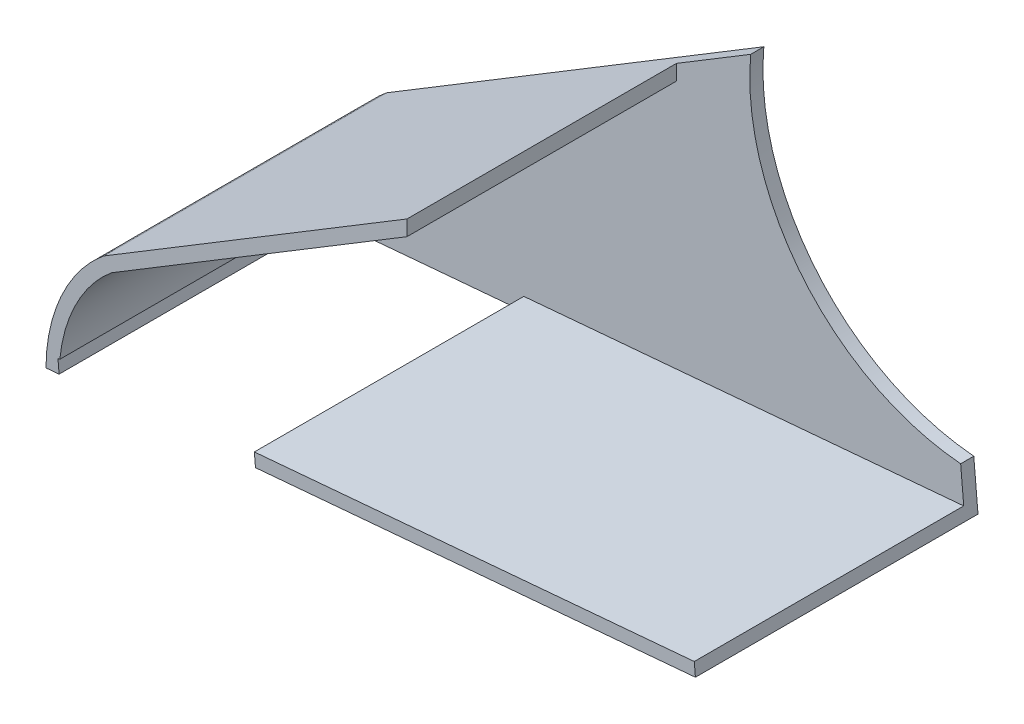
ISO-10303-21;
HEADER;
FILE_DESCRIPTION(('STEP AP214'),'2;1');
FILE_NAME('part.step','',(''),(''),'','','');
FILE_SCHEMA(('AUTOMOTIVE_DESIGN { 1 0 10303 214 1 1 1 1 }'));
ENDSEC;
DATA;
#1=APPLICATION_CONTEXT('core data for automotive mechanical design processes');
#2=APPLICATION_PROTOCOL_DEFINITION('international standard','automotive_design',2000,#1);
#3=PRODUCT_CONTEXT('',#1,'mechanical');
#4=PRODUCT('Part','Part','',(#3));
#5=PRODUCT_RELATED_PRODUCT_CATEGORY('part','',(#4));
#6=PRODUCT_DEFINITION_FORMATION('','',#4);
#7=PRODUCT_DEFINITION_CONTEXT('part definition',#1,'design');
#8=PRODUCT_DEFINITION('design','',#6,#7);
#9=PRODUCT_DEFINITION_SHAPE('','',#8);
#10=(LENGTH_UNIT() NAMED_UNIT(*) SI_UNIT(.MILLI.,.METRE.));
#11=(NAMED_UNIT(*) PLANE_ANGLE_UNIT() SI_UNIT($,.RADIAN.));
#12=(NAMED_UNIT(*) SI_UNIT($,.STERADIAN.) SOLID_ANGLE_UNIT());
#13=UNCERTAINTY_MEASURE_WITH_UNIT(LENGTH_MEASURE(1.E-05),#10,'distance_accuracy_value','');
#14=(GEOMETRIC_REPRESENTATION_CONTEXT(3) GLOBAL_UNCERTAINTY_ASSIGNED_CONTEXT((#13)) GLOBAL_UNIT_ASSIGNED_CONTEXT((#10,
#11,#12)) REPRESENTATION_CONTEXT('',''));
#15=CARTESIAN_POINT('',(0.,0.,0.));
#16=DIRECTION('',(0.,0.,1.));
#17=DIRECTION('',(1.,0.,0.));
#18=AXIS2_PLACEMENT_3D('',#15,#16,#17);
#19=CARTESIAN_POINT('',(0.,0.,40.5));
#20=DIRECTION('',(0.,0.,-1.));
#21=DIRECTION('',(-1.,0.,0.));
#22=AXIS2_PLACEMENT_3D('',#19,#20,#21);
#23=PLANE('',#22);
#24=DIRECTION('',(0.996194698091746,0.0871557427476548,0.));
#25=VECTOR('',#24,1.);
#26=CARTESIAN_POINT('',(3.64727503883378,-41.6885444564277,40.5));
#27=LINE('',#26,#25);
#28=CARTESIAN_POINT('',(-69.2564137144437,-48.0667907515616,40.5));
#29=VERTEX_POINT('',#28);
#30=CARTESIAN_POINT('',(-2.31617525973404,-42.2102787530527,40.5));
#31=VERTEX_POINT('',#30);
#32=EDGE_CURVE('E38',#29,#31,#27,.T.);
#33=ORIENTED_EDGE('',*,*,#32,.T.);
#34=DIRECTION('',(0.0871557427476548,-0.996194698091746,0.));
#35=VECTOR('',#34,1.);
#36=CARTESIAN_POINT('',(-7.10974111085505,12.5804296419934,40.5));
#37=LINE('',#36,#35);
#38=CARTESIAN_POINT('',(-2.49048674522935,-40.2178893568692,40.5));
#39=VERTEX_POINT('',#38);
#40=EDGE_CURVE('E272',#39,#31,#37,.T.);
#41=ORIENTED_EDGE('',*,*,#40,.F.);
#42=DIRECTION('',(-0.996194698091746,-0.0871557427476548,0.));
#43=VECTOR('',#42,1.);
#44=CARTESIAN_POINT('',(3.47296355333847,-39.6961550602442,40.5));
#45=LINE('',#44,#43);
#46=CARTESIAN_POINT('',(-69.430725199939,-46.0744013553781,40.5));
#47=VERTEX_POINT('',#46);
#48=EDGE_CURVE('E240',#39,#47,#45,.T.);
#49=ORIENTED_EDGE('',*,*,#48,.T.);
#50=DIRECTION('',(0.0871557427476548,-0.996194698091746,0.));
#51=VECTOR('',#50,1.);
#52=CARTESIAN_POINT('',(-73.8585457403114,4.53581900832169,40.5));
#53=LINE('',#52,#51);
#54=EDGE_CURVE('E43',#47,#29,#53,.T.);
#55=ORIENTED_EDGE('',*,*,#54,.T.);
#56=EDGE_LOOP('',(#33,#41,#49,#55));
#57=FACE_BOUND('',#56,.T.);
#58=ADVANCED_FACE('F34',(#57),#23,.F.);
#59=DIRECTION('',(0.,1.,0.));
#60=VECTOR('',#59,1.);
#61=CARTESIAN_POINT('',(-46.2091535170726,-3.76082341304886,40.5));
#62=LINE('',#61,#60);
#63=CARTESIAN_POINT('',(-46.2091535170726,-6.09907969838551,40.5));
#64=VERTEX_POINT('',#63);
#65=CARTESIAN_POINT('',(-46.2091535170726,-3.76082341304886,40.5));
#66=VERTEX_POINT('',#65);
#67=EDGE_CURVE('E11',#64,#66,#62,.T.);
#68=ORIENTED_EDGE('',*,*,#67,.T.);
#69=DIRECTION('',(-0.855338233256186,-0.518069982463939,0.));
#70=VECTOR('',#69,1.);
#71=CARTESIAN_POINT('',(-40.,0.,40.5));
#72=LINE('',#71,#70);
#73=CARTESIAN_POINT('',(-92.3119086872845,-31.684810245305,40.5));
#74=VERTEX_POINT('',#73);
#75=EDGE_CURVE('E51',#66,#74,#72,.T.);
#76=ORIENTED_EDGE('',*,*,#75,.T.);
#77=CARTESIAN_POINT('',(-101.13464405338,-50.8557745194866,40.5));
#78=CARTESIAN_POINT('',(-101.13464405338,-43.6373707117498,40.5));
#79=CARTESIAN_POINT('',(-97.9546061806146,-36.2754669599375,40.5));
#80=CARTESIAN_POINT('',(-92.3119086872845,-31.684810245305,40.5));
#81=B_SPLINE_CURVE_WITH_KNOTS('',3,(#77,#78,#79,#80),.UNSPECIFIED.,.F.,.F.,(4,4),(0.,1.),.UNSPECIFIED.);
#82=CARTESIAN_POINT('',(-101.13464405338,-50.8557745194866,40.5));
#83=VERTEX_POINT('',#82);
#84=EDGE_CURVE('E275',#83,#74,#81,.T.);
#85=ORIENTED_EDGE('',*,*,#84,.F.);
#86=CARTESIAN_POINT('',(-99.1422546571961,-50.6814630339913,40.5));
#87=VERTEX_POINT('',#86);
#88=EDGE_CURVE('E274',#83,#87,#27,.T.);
#89=ORIENTED_EDGE('',*,*,#88,.T.);
#90=DIRECTION('',(0.0871557427476548,-0.996194698091746,0.));
#91=VECTOR('',#90,1.);
#92=CARTESIAN_POINT('',(-103.744386683064,1.92114672589204,40.5));
#93=LINE('',#92,#91);
#94=CARTESIAN_POINT('',(-99.3165661426914,-48.6890736378078,40.5));
#95=VERTEX_POINT('',#94);
#96=EDGE_CURVE('E174',#95,#87,#93,.T.);
#97=ORIENTED_EDGE('',*,*,#96,.F.);
#98=DIRECTION('',(0.996194698091746,0.0871557427476548,0.));
#99=VECTOR('',#98,1.);
#100=CARTESIAN_POINT('',(-99.3165661426914,-48.6890736378078,40.5));
#101=LINE('',#100,#99);
#102=CARTESIAN_POINT('',(-99.0293596275736,-48.6639463236442,40.5));
#103=VERTEX_POINT('',#102);
#104=EDGE_CURVE('E175',#95,#103,#101,.T.);
#105=ORIENTED_EDGE('',*,*,#104,.T.);
#106=CARTESIAN_POINT('',(-99.0293596275736,-48.6639463236442,40.5));
#107=CARTESIAN_POINT('',(-98.9822160371807,-48.1716584048943,40.5));
#108=CARTESIAN_POINT('',(-98.9194953881602,-47.6808925105968,40.5));
#109=CARTESIAN_POINT('',(-98.7635710622691,-46.7043179762501,40.5));
#110=CARTESIAN_POINT('',(-98.670373107887,-46.2185084232312,40.5));
#111=CARTESIAN_POINT('',(-98.4536068798442,-45.2511629702879,40.5));
#112=CARTESIAN_POINT('',(-98.3298891856738,-44.769660552501,40.5));
#113=CARTESIAN_POINT('',(-98.0528488570563,-43.8151861668131,40.5));
#114=CARTESIAN_POINT('',(-97.8995213140705,-43.3422156275084,40.5));
#115=CARTESIAN_POINT('',(-97.5114695632854,-42.2611811866168,40.5));
#116=CARTESIAN_POINT('',(-97.2662605714497,-41.6568447116305,40.5));
#117=CARTESIAN_POINT('',(-96.7265246717184,-40.4704328507377,40.5));
#118=CARTESIAN_POINT('',(-96.4319850974101,-39.8883632294736,40.5));
#119=CARTESIAN_POINT('',(-95.7951786706989,-38.752813793632,40.5));
#120=CARTESIAN_POINT('',(-95.4530351746371,-38.1992649970935,40.5));
#121=CARTESIAN_POINT('',(-94.7215303021037,-37.1246664328059,40.5));
#122=CARTESIAN_POINT('',(-94.3321926629075,-36.6036005251823,40.5));
#123=CARTESIAN_POINT('',(-93.5043671140737,-35.5957110204897,40.5));
#124=CARTESIAN_POINT('',(-93.0655553051716,-35.1091516304756,40.5));
#125=CARTESIAN_POINT('',(-92.3737453576507,-34.412812585773,40.5));
#126=CARTESIAN_POINT('',(-92.1374763634909,-34.186227387526,40.5));
#127=CARTESIAN_POINT('',(-91.6540147667616,-33.7449602321875,40.5));
#128=CARTESIAN_POINT('',(-91.4068206154479,-33.5302799725222,40.5));
#129=CARTESIAN_POINT('',(-91.154320005164,-33.3219264144521,40.5));
#130=B_SPLINE_CURVE_WITH_KNOTS('',3,(#106,#107,#108,#109,#110,#111,#112,#113,#114,#115,#116,
#117,#118,#119,#120,#121,#122,#123,#124,#125,#126,#127,#128,#129),.UNSPECIFIED.,.F.,.F.,(4,2,2,
2,2,2,2,2,2,2,2,4),(0.,1.48332764847661,2.96637694373019,4.45683639037946,5.94754312865276,
7.90181542060943,9.85659027455259,11.8063909143395,13.7552148991849,15.7176327179899,
16.6993613492844,17.6812295990816),.UNSPECIFIED.);
#131=CARTESIAN_POINT('',(-91.154320005164,-33.3219264144521,40.5));
#132=VERTEX_POINT('',#131);
#133=EDGE_CURVE('E178',#103,#132,#130,.T.);
#134=ORIENTED_EDGE('',*,*,#133,.T.);
#135=DIRECTION('',(-0.855338233256186,-0.518069982463939,0.));
#136=VECTOR('',#135,1.);
#137=CARTESIAN_POINT('',(-9.71410191691998,16.0056152718541,40.5));
#138=LINE('',#137,#136);
#139=EDGE_CURVE('E57',#64,#132,#138,.T.);
#140=ORIENTED_EDGE('',*,*,#139,.F.);
#141=EDGE_LOOP('',(#68,#76,#85,#89,#97,#105,#134,#140));
#142=FACE_BOUND('',#141,.T.);
#143=ADVANCED_FACE('F36',(#142),#23,.F.);
#144=CARTESIAN_POINT('',(-101.13464405338,-50.8557745194866,-12.5));
#145=CARTESIAN_POINT('',(-101.13464405338,-43.6373707117498,-12.5));
#146=CARTESIAN_POINT('',(-97.9546061806146,-36.2754669599375,-12.5));
#147=CARTESIAN_POINT('',(-92.3119086872845,-31.684810245305,-12.5));
#148=B_SPLINE_CURVE_WITH_KNOTS('',3,(#144,#145,#146,#147),.UNSPECIFIED.,.F.,.F.,(4,4),(0.,1.),.UNSPECIFIED.);
#149=DIRECTION('',(0.,0.,1.));
#150=VECTOR('',#149,1.);
#151=SURFACE_OF_LINEAR_EXTRUSION('',#148,#150);
#152=OFFSET_SURFACE('',#151,2.,.F.);
#153=CARTESIAN_POINT('',(-91.154320005164,-33.3219264144521,-0.5));
#154=CARTESIAN_POINT('',(-91.5385785647613,-33.6389572466407,-0.5));
#155=CARTESIAN_POINT('',(-91.9105461909236,-33.9707144815606,-0.5));
#156=CARTESIAN_POINT('',(-92.6286335759638,-34.660702212799,-0.5));
#157=CARTESIAN_POINT('',(-92.9747693619291,-35.0189160152299,-0.5));
#158=CARTESIAN_POINT('',(-93.6400508363749,-35.7588409543531,-0.5));
#159=CARTESIAN_POINT('',(-93.9592252886046,-36.1405262792923,-0.5));
#160=CARTESIAN_POINT('',(-94.5703931559296,-36.9251758816484,-0.5));
#161=CARTESIAN_POINT('',(-94.8623793151631,-37.3281457946662,-0.500000000000001));
#162=CARTESIAN_POINT('',(-95.5050068183384,-38.2809467145433,-0.500000000000001));
#163=CARTESIAN_POINT('',(-95.8456990779171,-38.8375183379696,-0.5));
#164=CARTESIAN_POINT('',(-96.4785522928618,-39.977686237539,-0.5));
#165=CARTESIAN_POINT('',(-96.7707001083469,-40.5612897761235,-0.5));
#166=CARTESIAN_POINT('',(-97.3057534286723,-41.7509564318915,-0.5));
#167=CARTESIAN_POINT('',(-97.5486363352527,-42.3570297060574,-0.5));
#168=CARTESIAN_POINT('',(-97.9841410808375,-43.586967948391,-0.5));
#169=CARTESIAN_POINT('',(-98.1767602821205,-44.2108338483692,-0.500000000000001));
#170=CARTESIAN_POINT('',(-98.5098099334601,-45.4689549158462,-0.500000000000001));
#171=CARTESIAN_POINT('',(-98.6505066633262,-46.1031391539247,-0.5));
#172=CARTESIAN_POINT('',(-98.822235836251,-47.0602123311206,-0.5));
#173=CARTESIAN_POINT('',(-98.8728768241805,-47.3796907659938,-0.5));
#174=CARTESIAN_POINT('',(-98.9610233882574,-48.0205344716746,-0.5));
#175=CARTESIAN_POINT('',(-98.9985257051465,-48.3419001905792,-0.5));
#176=CARTESIAN_POINT('',(-99.0293596275736,-48.6639463236441,-0.500000000000001));
#177=B_SPLINE_CURVE_WITH_KNOTS('',3,(#153,#154,#155,#156,#157,#158,#159,#160,#161,#162,#163,
#164,#165,#166,#167,#168,#169,#170,#171,#172,#173,#174,#175,#176),.UNSPECIFIED.,.F.,.F.,(4,2,2,
2,2,2,2,2,2,2,2,4),(0.,1.49395269743162,2.98697064618288,4.47837510141668,5.97017644049493,
7.92531657752556,9.88098506763551,11.8375486218887,13.7942148313738,15.7407022154191,
16.7108683814179,17.6812750425756),.UNSPECIFIED.);
#178=CARTESIAN_POINT('',(-91.154320005164,-33.3219264144521,-0.5));
#179=VERTEX_POINT('',#178);
#180=CARTESIAN_POINT('',(-99.0293596275736,-48.6639463236442,-0.5));
#181=VERTEX_POINT('',#180);
#182=EDGE_CURVE('E233',#179,#181,#177,.T.);
#183=ORIENTED_EDGE('',*,*,#182,.F.);
#184=DIRECTION('',(0.,0.,1.));
#185=VECTOR('',#184,1.);
#186=CARTESIAN_POINT('',(-91.154320005164,-33.3219264144521,-0.5));
#187=LINE('',#186,#185);
#188=EDGE_CURVE('E197',#179,#132,#187,.T.);
#189=ORIENTED_EDGE('',*,*,#188,.T.);
#190=ORIENTED_EDGE('',*,*,#133,.F.);
#191=DIRECTION('',(0.,0.,1.));
#192=VECTOR('',#191,1.);
#193=CARTESIAN_POINT('',(-99.0293596275736,-48.6639463236442,-0.5));
#194=LINE('',#193,#192);
#195=EDGE_CURVE('E244',#181,#103,#194,.T.);
#196=ORIENTED_EDGE('',*,*,#195,.F.);
#197=EDGE_LOOP('',(#183,#189,#190,#196));
#198=FACE_BOUND('',#197,.T.);
#199=ADVANCED_FACE('F218',(#198),#152,.T.);
#200=CARTESIAN_POINT('',(-40.,0.,-133.966475675911));
#201=DIRECTION('',(-0.518069982463939,0.855338233256186,0.));
#202=DIRECTION('',(-0.855338233256186,-0.518069982463939,0.));
#203=AXIS2_PLACEMENT_3D('',#200,#201,#202);
#204=PLANE('',#203);
#205=ORIENTED_EDGE('',*,*,#75,.F.);
#206=DIRECTION('',(0.,0.,-1.));
#207=VECTOR('',#206,1.);
#208=CARTESIAN_POINT('',(-46.2091535170726,-3.76082341304886,46.5514350356408));
#209=LINE('',#208,#207);
#210=CARTESIAN_POINT('',(-46.2091535170726,-3.76082341304886,-0.5));
#211=VERTEX_POINT('',#210);
#212=EDGE_CURVE('E153',#66,#211,#209,.T.);
#213=ORIENTED_EDGE('',*,*,#212,.T.);
#214=DIRECTION('',(-0.855338233256186,-0.518069982463939,0.));
#215=VECTOR('',#214,1.);
#216=CARTESIAN_POINT('',(-34.905582260072,3.0856388812892,-0.5));
#217=LINE('',#216,#215);
#218=CARTESIAN_POINT('',(-34.905582260072,3.0856388812892,-0.5));
#219=VERTEX_POINT('',#218);
#220=EDGE_CURVE('E138',#219,#211,#217,.T.);
#221=ORIENTED_EDGE('',*,*,#220,.F.);
#222=DIRECTION('',(0.,0.,1.));
#223=VECTOR('',#222,1.);
#224=CARTESIAN_POINT('',(-34.905582260072,3.0856388812892,-2.));
#225=LINE('',#224,#223);
#226=CARTESIAN_POINT('',(-34.905582260072,3.0856388812892,-2.5));
#227=VERTEX_POINT('',#226);
#228=EDGE_CURVE('E148',#227,#219,#225,.T.);
#229=ORIENTED_EDGE('',*,*,#228,.F.);
#230=DIRECTION('',(0.855338233256186,0.518069982463939,0.));
#231=VECTOR('',#230,1.);
#232=CARTESIAN_POINT('',(-123.943299631463,-50.8436336377494,-2.5));
#233=LINE('',#232,#231);
#234=CARTESIAN_POINT('',(-92.3119086872845,-31.684810245305,-2.5));
#235=VERTEX_POINT('',#234);
#236=EDGE_CURVE('E259',#235,#227,#233,.T.);
#237=ORIENTED_EDGE('',*,*,#236,.F.);
#238=DIRECTION('',(0.,0.,1.));
#239=VECTOR('',#238,1.);
#240=CARTESIAN_POINT('',(-92.3119086872845,-31.684810245305,-12.5));
#241=LINE('',#240,#239);
#242=EDGE_CURVE('E247',#235,#74,#241,.T.);
#243=ORIENTED_EDGE('',*,*,#242,.T.);
#244=EDGE_LOOP('',(#205,#213,#221,#229,#237,#243));
#245=FACE_BOUND('',#244,.T.);
#246=ADVANCED_FACE('F157',(#245),#204,.T.);
#247=CARTESIAN_POINT('',(-0.0207697284744204,0.00183603531541141,-0.5));
#248=DIRECTION('',(0.,0.,1.));
#249=DIRECTION('',(1.,0.,0.));
#250=AXIS2_PLACEMENT_3D('',#247,#248,#249);
#251=PLANE('',#250);
#252=ORIENTED_EDGE('',*,*,#220,.T.);
#253=DIRECTION('',(0.,-1.,0.));
#254=VECTOR('',#253,1.);
#255=CARTESIAN_POINT('',(-46.2091535170726,-3.76082341304886,-0.5));
#256=LINE('',#255,#254);
#257=CARTESIAN_POINT('',(-46.2091535170726,-6.09907969838551,-0.5));
#258=VERTEX_POINT('',#257);
#259=EDGE_CURVE('E141',#211,#258,#256,.T.);
#260=ORIENTED_EDGE('',*,*,#259,.T.);
#261=DIRECTION('',(0.855338233256186,0.518069982463939,0.));
#262=VECTOR('',#261,1.);
#263=CARTESIAN_POINT('',(-9.71410191691998,16.0056152718541,-0.5));
#264=LINE('',#263,#262);
#265=EDGE_CURVE('E243',#179,#258,#264,.T.);
#266=ORIENTED_EDGE('',*,*,#265,.F.);
#267=ORIENTED_EDGE('',*,*,#182,.T.);
#268=DIRECTION('',(-0.996194698091746,-0.0871557427476548,0.));
#269=VECTOR('',#268,1.);
#270=CARTESIAN_POINT('',(-99.3165661426914,-48.6890736378078,-0.5));
#271=LINE('',#270,#269);
#272=CARTESIAN_POINT('',(-99.3165661426914,-48.6890736378078,-0.5));
#273=VERTEX_POINT('',#272);
#274=EDGE_CURVE('E181',#181,#273,#271,.T.);
#275=ORIENTED_EDGE('',*,*,#274,.T.);
#276=DIRECTION('',(0.0871557427476548,-0.996194698091746,0.));
#277=VECTOR('',#276,1.);
#278=CARTESIAN_POINT('',(-103.744386683064,1.92114672589205,-0.499999999999997));
#279=LINE('',#278,#277);
#280=CARTESIAN_POINT('',(-99.1422546571963,-50.6814630339913,-0.5));
#281=VERTEX_POINT('',#280);
#282=EDGE_CURVE('E189',#273,#281,#279,.T.);
#283=ORIENTED_EDGE('',*,*,#282,.T.);
#284=DIRECTION('',(0.996194698091746,0.0871557427476547,0.));
#285=VECTOR('',#284,1.);
#286=CARTESIAN_POINT('',(-99.1422546571961,-50.6814630339913,-0.5));
#287=LINE('',#286,#285);
#288=CARTESIAN_POINT('',(-69.2564137144437,-48.0667907515616,-0.5));
#289=VERTEX_POINT('',#288);
#290=EDGE_CURVE('E183',#281,#289,#287,.T.);
#291=ORIENTED_EDGE('',*,*,#290,.T.);
#292=DIRECTION('',(0.0871557427476548,-0.996194698091746,0.));
#293=VECTOR('',#292,1.);
#294=CARTESIAN_POINT('',(-73.8585457403114,4.53581900832169,-0.499999999999997));
#295=LINE('',#294,#293);
#296=CARTESIAN_POINT('',(-69.430725199939,-46.0744013553781,-0.5));
#297=VERTEX_POINT('',#296);
#298=EDGE_CURVE('E191',#297,#289,#295,.T.);
#299=ORIENTED_EDGE('',*,*,#298,.F.);
#300=DIRECTION('',(0.996194698091746,0.0871557427476548,0.));
#301=VECTOR('',#300,1.);
#302=CARTESIAN_POINT('',(3.47296355333847,-39.6961550602442,-0.5));
#303=LINE('',#302,#301);
#304=CARTESIAN_POINT('',(-2.49048674522935,-40.2178893568692,-0.5));
#305=VERTEX_POINT('',#304);
#306=EDGE_CURVE('E239',#297,#305,#303,.T.);
#307=ORIENTED_EDGE('',*,*,#306,.T.);
#308=DIRECTION('',(0.0871557427476548,-0.996194698091746,0.));
#309=VECTOR('',#308,1.);
#310=CARTESIAN_POINT('',(-5.96376748008357,-0.518108895310424,-0.5));
#311=LINE('',#310,#309);
#312=CARTESIAN_POINT('',(-2.9561107878706,-34.8957821960562,-0.5));
#313=VERTEX_POINT('',#312);
#314=EDGE_CURVE('E166',#313,#305,#311,.T.);
#315=ORIENTED_EDGE('',*,*,#314,.F.);
#316=CARTESIAN_POINT('',(-0.0207697284744204,0.00183603531541141,-0.5));
#317=DIRECTION('',(0.,0.,-1.));
#318=DIRECTION('',(1.,0.,0.));
#319=AXIS2_PLACEMENT_3D('',#316,#317,#318);
#320=CIRCLE('',#319,35.0208507229271);
#321=EDGE_CURVE('E145',#313,#219,#320,.T.);
#322=ORIENTED_EDGE('',*,*,#321,.T.);
#323=EDGE_LOOP('',(#252,#260,#266,#267,#275,#283,#291,#299,#307,#315,#322));
#324=FACE_BOUND('',#323,.T.);
#325=ADVANCED_FACE('F140',(#324),#251,.T.);
#326=CARTESIAN_POINT('',(-38.9638600350721,-1.71067646651237,-133.966475675911));
#327=DIRECTION('',(-0.518069982463939,0.855338233256186,0.));
#328=DIRECTION('',(-0.855338233256186,-0.518069982463939,0.));
#329=AXIS2_PLACEMENT_3D('',#326,#327,#328);
#330=PLANE('',#329);
#331=DIRECTION('',(0.,0.,-1.));
#332=VECTOR('',#331,1.);
#333=CARTESIAN_POINT('',(-46.2091535170726,-6.09907969838551,46.5514350356408));
#334=LINE('',#333,#332);
#335=EDGE_CURVE('E155',#64,#258,#334,.T.);
#336=ORIENTED_EDGE('',*,*,#335,.F.);
#337=ORIENTED_EDGE('',*,*,#139,.T.);
#338=ORIENTED_EDGE('',*,*,#188,.F.);
#339=ORIENTED_EDGE('',*,*,#265,.T.);
#340=EDGE_LOOP('',(#336,#337,#338,#339));
#341=FACE_BOUND('',#340,.T.);
#342=ADVANCED_FACE('F307',(#341),#330,.F.);
#343=CARTESIAN_POINT('',(-46.2091535170726,-3.76082341304886,46.5514350356408));
#344=DIRECTION('',(1.,0.,0.));
#345=DIRECTION('',(0.,0.,-1.));
#346=AXIS2_PLACEMENT_3D('',#343,#344,#345);
#347=PLANE('',#346);
#348=ORIENTED_EDGE('',*,*,#335,.T.);
#349=ORIENTED_EDGE('',*,*,#259,.F.);
#350=ORIENTED_EDGE('',*,*,#212,.F.);
#351=ORIENTED_EDGE('',*,*,#67,.F.);
#352=EDGE_LOOP('',(#348,#349,#350,#351));
#353=FACE_BOUND('',#352,.T.);
#354=ADVANCED_FACE('F152',(#353),#347,.T.);
#355=CARTESIAN_POINT('',(-0.0207697284744204,0.00183603531541141,-2.));
#356=DIRECTION('',(0.,0.,1.));
#357=DIRECTION('',(1.,0.,0.));
#358=AXIS2_PLACEMENT_3D('',#355,#356,#357);
#359=CYLINDRICAL_SURFACE('',#358,35.0208507229271);
#360=DIRECTION('',(0.,0.,1.));
#361=VECTOR('',#360,1.);
#362=CARTESIAN_POINT('',(-2.9561107878706,-34.8957821960562,-2.));
#363=LINE('',#362,#361);
#364=CARTESIAN_POINT('',(-2.9561107878706,-34.8957821960563,-2.5));
#365=VERTEX_POINT('',#364);
#366=EDGE_CURVE('E168',#365,#313,#363,.T.);
#367=ORIENTED_EDGE('',*,*,#366,.F.);
#368=CARTESIAN_POINT('',(-0.0207697284744204,0.00183603531541141,-2.5));
#369=DIRECTION('',(0.,0.,1.));
#370=DIRECTION('',(-1.,0.,0.));
#371=AXIS2_PLACEMENT_3D('',#368,#369,#370);
#372=CIRCLE('',#371,35.0208507229271);
#373=EDGE_CURVE('E261',#227,#365,#372,.T.);
#374=ORIENTED_EDGE('',*,*,#373,.F.);
#375=ORIENTED_EDGE('',*,*,#228,.T.);
#376=ORIENTED_EDGE('',*,*,#321,.F.);
#377=EDGE_LOOP('',(#367,#374,#375,#376));
#378=FACE_BOUND('',#377,.T.);
#379=ADVANCED_FACE('F324',(#378),#359,.F.);
#380=CARTESIAN_POINT('',(-0.0207697284744204,0.00183603531541141,-2.5));
#381=DIRECTION('',(0.,0.,-1.));
#382=DIRECTION('',(-1.,0.,0.));
#383=AXIS2_PLACEMENT_3D('',#380,#381,#382);
#384=PLANE('',#383);
#385=DIRECTION('',(0.0871557427476548,-0.996194698091746,0.));
#386=VECTOR('',#385,1.);
#387=CARTESIAN_POINT('',(-7.10974111085505,12.5804296419934,-2.5));
#388=LINE('',#387,#386);
#389=CARTESIAN_POINT('',(-2.31617525973403,-42.2102787530527,-2.5));
#390=VERTEX_POINT('',#389);
#391=EDGE_CURVE('E160',#365,#390,#388,.T.);
#392=ORIENTED_EDGE('',*,*,#391,.T.);
#393=DIRECTION('',(0.996194698091746,0.0871557427476548,0.));
#394=VECTOR('',#393,1.);
#395=CARTESIAN_POINT('',(-123.768988145968,-52.836023033933,-2.5));
#396=LINE('',#395,#394);
#397=CARTESIAN_POINT('',(-101.13464405338,-50.8557745194866,-2.5));
#398=VERTEX_POINT('',#397);
#399=EDGE_CURVE('E253',#398,#390,#396,.T.);
#400=ORIENTED_EDGE('',*,*,#399,.F.);
#401=CARTESIAN_POINT('',(-101.13464405338,-50.8557745194866,-2.5));
#402=CARTESIAN_POINT('',(-101.13464405338,-43.6373707117498,-2.5));
#403=CARTESIAN_POINT('',(-97.9546061806146,-36.2754669599375,-2.5));
#404=CARTESIAN_POINT('',(-92.3119086872845,-31.684810245305,-2.5));
#405=B_SPLINE_CURVE_WITH_KNOTS('',3,(#401,#402,#403,#404),.UNSPECIFIED.,.F.,.F.,(4,4),(0.,1.),.UNSPECIFIED.);
#406=EDGE_CURVE('E249',#235,#398,#405,.F.);
#407=ORIENTED_EDGE('',*,*,#406,.F.);
#408=ORIENTED_EDGE('',*,*,#236,.T.);
#409=ORIENTED_EDGE('',*,*,#373,.T.);
#410=EDGE_LOOP('',(#392,#400,#407,#408,#409));
#411=FACE_BOUND('',#410,.T.);
#412=ADVANCED_FACE('F288',(#411),#384,.T.);
#413=CARTESIAN_POINT('',(3.64727503883378,-41.6885444564277,0.));
#414=DIRECTION('',(0.0871557427476548,-0.996194698091746,0.));
#415=DIRECTION('',(0.996194698091746,0.0871557427476548,0.));
#416=AXIS2_PLACEMENT_3D('',#413,#414,#415);
#417=PLANE('',#416);
#418=ORIENTED_EDGE('',*,*,#88,.F.);
#419=DIRECTION('',(0.,0.,1.));
#420=VECTOR('',#419,1.);
#421=CARTESIAN_POINT('',(-101.13464405338,-50.8557745194866,0.));
#422=LINE('',#421,#420);
#423=EDGE_CURVE('E266',#398,#83,#422,.T.);
#424=ORIENTED_EDGE('',*,*,#423,.F.);
#425=ORIENTED_EDGE('',*,*,#399,.T.);
#426=DIRECTION('',(0.,0.,-1.));
#427=VECTOR('',#426,1.);
#428=CARTESIAN_POINT('',(-2.31617525973404,-42.2102787530527,42.5));
#429=LINE('',#428,#427);
#430=EDGE_CURVE('E158',#31,#390,#429,.T.);
#431=ORIENTED_EDGE('',*,*,#430,.F.);
#432=ORIENTED_EDGE('',*,*,#32,.F.);
#433=DIRECTION('',(0.,0.,1.));
#434=VECTOR('',#433,1.);
#435=CARTESIAN_POINT('',(-69.2564137144437,-48.0667907515616,-0.5));
#436=LINE('',#435,#434);
#437=EDGE_CURVE('E186',#289,#29,#436,.T.);
#438=ORIENTED_EDGE('',*,*,#437,.F.);
#439=ORIENTED_EDGE('',*,*,#290,.F.);
#440=DIRECTION('',(0.,0.,-1.));
#441=VECTOR('',#440,1.);
#442=CARTESIAN_POINT('',(-99.1422546571961,-50.6814630339913,-0.5));
#443=LINE('',#442,#441);
#444=EDGE_CURVE('E170',#87,#281,#443,.T.);
#445=ORIENTED_EDGE('',*,*,#444,.F.);
#446=EDGE_LOOP('',(#418,#424,#425,#431,#432,#438,#439,#445));
#447=FACE_BOUND('',#446,.T.);
#448=ADVANCED_FACE('F291',(#447),#417,.T.);
#449=CARTESIAN_POINT('',(3.47296355333847,-39.6961550602442,0.));
#450=DIRECTION('',(0.0871557427476548,-0.996194698091746,0.));
#451=DIRECTION('',(0.996194698091746,0.0871557427476548,0.));
#452=AXIS2_PLACEMENT_3D('',#449,#450,#451);
#453=PLANE('',#452);
#454=ORIENTED_EDGE('',*,*,#48,.F.);
#455=DIRECTION('',(0.,0.,-1.));
#456=VECTOR('',#455,1.);
#457=CARTESIAN_POINT('',(-2.49048674522934,-40.2178893568692,0.));
#458=LINE('',#457,#456);
#459=EDGE_CURVE('E269',#39,#305,#458,.T.);
#460=ORIENTED_EDGE('',*,*,#459,.T.);
#461=ORIENTED_EDGE('',*,*,#306,.F.);
#462=DIRECTION('',(0.,0.,-1.));
#463=VECTOR('',#462,1.);
#464=CARTESIAN_POINT('',(-69.430725199939,-46.0744013553781,-0.5));
#465=LINE('',#464,#463);
#466=EDGE_CURVE('E171',#47,#297,#465,.T.);
#467=ORIENTED_EDGE('',*,*,#466,.F.);
#468=EDGE_LOOP('',(#454,#460,#461,#467));
#469=FACE_BOUND('',#468,.T.);
#470=ADVANCED_FACE('F318',(#469),#453,.F.);
#471=CARTESIAN_POINT('',(-7.10974111085505,12.5804296419934,42.5));
#472=DIRECTION('',(-0.996194698091746,-0.0871557427476548,0.));
#473=DIRECTION('',(0.0871557427476548,-0.996194698091746,0.));
#474=AXIS2_PLACEMENT_3D('',#471,#472,#473);
#475=PLANE('',#474);
#476=ORIENTED_EDGE('',*,*,#459,.F.);
#477=ORIENTED_EDGE('',*,*,#40,.T.);
#478=ORIENTED_EDGE('',*,*,#430,.T.);
#479=ORIENTED_EDGE('',*,*,#391,.F.);
#480=ORIENTED_EDGE('',*,*,#366,.T.);
#481=ORIENTED_EDGE('',*,*,#314,.T.);
#482=EDGE_LOOP('',(#476,#477,#478,#479,#480,#481));
#483=FACE_BOUND('',#482,.T.);
#484=ADVANCED_FACE('F321',(#483),#475,.F.);
#485=CARTESIAN_POINT('',(-103.744386683064,1.92114672589205,-0.499999999999997));
#486=DIRECTION('',(-0.996194698091746,-0.0871557427476548,0.));
#487=DIRECTION('',(0.0871557427476548,-0.996194698091746,0.));
#488=AXIS2_PLACEMENT_3D('',#485,#486,#487);
#489=PLANE('',#488);
#490=DIRECTION('',(0.,0.,1.));
#491=VECTOR('',#490,1.);
#492=CARTESIAN_POINT('',(-99.3165661426914,-48.6890736378078,-0.5));
#493=LINE('',#492,#491);
#494=EDGE_CURVE('E173',#273,#95,#493,.T.);
#495=ORIENTED_EDGE('',*,*,#494,.T.);
#496=ORIENTED_EDGE('',*,*,#96,.T.);
#497=ORIENTED_EDGE('',*,*,#444,.T.);
#498=ORIENTED_EDGE('',*,*,#282,.F.);
#499=EDGE_LOOP('',(#495,#496,#497,#498));
#500=FACE_BOUND('',#499,.T.);
#501=ADVANCED_FACE('F214',(#500),#489,.F.);
#502=CARTESIAN_POINT('',(3.47296355333847,-39.6961550602442,0.));
#503=DIRECTION('',(0.0871557427476548,-0.996194698091746,0.));
#504=DIRECTION('',(0.996194698091746,0.0871557427476548,0.));
#505=AXIS2_PLACEMENT_3D('',#502,#503,#504);
#506=PLANE('',#505);
#507=ORIENTED_EDGE('',*,*,#104,.F.);
#508=ORIENTED_EDGE('',*,*,#494,.F.);
#509=ORIENTED_EDGE('',*,*,#274,.F.);
#510=ORIENTED_EDGE('',*,*,#195,.T.);
#511=EDGE_LOOP('',(#507,#508,#509,#510));
#512=FACE_BOUND('',#511,.T.);
#513=ADVANCED_FACE('F310',(#512),#506,.T.);
#514=CARTESIAN_POINT('',(-73.8585457403114,4.53581900832169,-0.499999999999997));
#515=DIRECTION('',(0.996194698091746,0.0871557427476548,0.));
#516=DIRECTION('',(-0.0871557427476548,0.996194698091746,0.));
#517=AXIS2_PLACEMENT_3D('',#514,#515,#516);
#518=PLANE('',#517);
#519=ORIENTED_EDGE('',*,*,#466,.T.);
#520=ORIENTED_EDGE('',*,*,#298,.T.);
#521=ORIENTED_EDGE('',*,*,#437,.T.);
#522=ORIENTED_EDGE('',*,*,#54,.F.);
#523=EDGE_LOOP('',(#519,#520,#521,#522));
#524=FACE_BOUND('',#523,.T.);
#525=ADVANCED_FACE('F212',(#524),#518,.F.);
#526=CARTESIAN_POINT('',(-101.13464405338,-50.8557745194866,-12.5));
#527=CARTESIAN_POINT('',(-101.13464405338,-43.6373707117498,-12.5));
#528=CARTESIAN_POINT('',(-97.9546061806146,-36.2754669599375,-12.5));
#529=CARTESIAN_POINT('',(-92.3119086872845,-31.684810245305,-12.5));
#530=B_SPLINE_CURVE_WITH_KNOTS('',3,(#526,#527,#528,#529),.UNSPECIFIED.,.F.,.F.,(4,4),(0.,1.),.UNSPECIFIED.);
#531=DIRECTION('',(0.,0.,1.));
#532=VECTOR('',#531,1.);
#533=SURFACE_OF_LINEAR_EXTRUSION('',#530,#532);
#534=ORIENTED_EDGE('',*,*,#423,.T.);
#535=ORIENTED_EDGE('',*,*,#84,.T.);
#536=ORIENTED_EDGE('',*,*,#242,.F.);
#537=ORIENTED_EDGE('',*,*,#406,.T.);
#538=EDGE_LOOP('',(#534,#535,#536,#537));
#539=FACE_BOUND('',#538,.T.);
#540=ADVANCED_FACE('F207',(#539),#533,.F.);
#541=CLOSED_SHELL('',(#58,#143,#199,#246,#325,#342,#354,#379,#412,#448,#470,#484,#501,#513,#525,#540));
#542=MANIFOLD_SOLID_BREP('B2',#541);
#543=ADVANCED_BREP_SHAPE_REPRESENTATION('',(#18,#542),#14);
#544=SHAPE_DEFINITION_REPRESENTATION(#9,#543);
ENDSEC;
END-ISO-10303-21;
